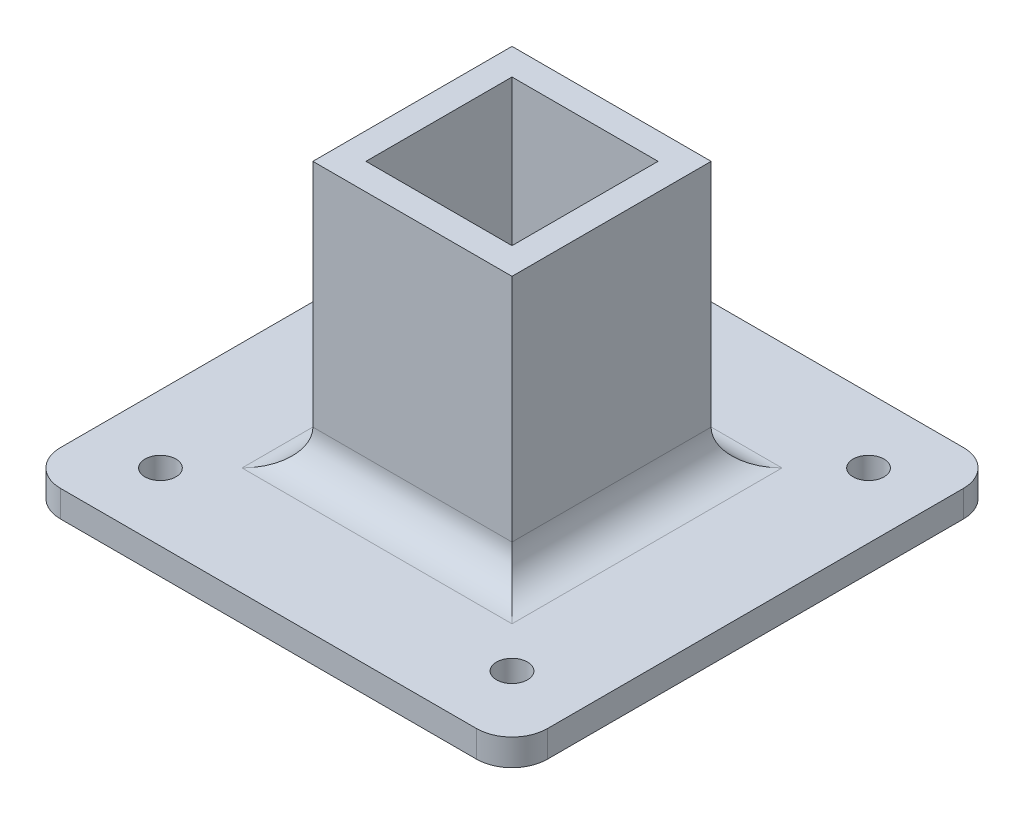
ISO-10303-21;
HEADER;
FILE_DESCRIPTION(('STEP AP214'),'2;1');
FILE_NAME('part.step','',(''),(''),'','','');
FILE_SCHEMA(('AUTOMOTIVE_DESIGN { 1 0 10303 214 1 1 1 1 }'));
ENDSEC;
DATA;
#1=APPLICATION_CONTEXT('core data for automotive mechanical design processes');
#2=APPLICATION_PROTOCOL_DEFINITION('international standard','automotive_design',2000,#1);
#3=PRODUCT_CONTEXT('',#1,'mechanical');
#4=PRODUCT('Part','Part','',(#3));
#5=PRODUCT_RELATED_PRODUCT_CATEGORY('part','',(#4));
#6=PRODUCT_DEFINITION_FORMATION('','',#4);
#7=PRODUCT_DEFINITION_CONTEXT('part definition',#1,'design');
#8=PRODUCT_DEFINITION('design','',#6,#7);
#9=PRODUCT_DEFINITION_SHAPE('','',#8);
#10=(LENGTH_UNIT() NAMED_UNIT(*) SI_UNIT(.MILLI.,.METRE.));
#11=(NAMED_UNIT(*) PLANE_ANGLE_UNIT() SI_UNIT($,.RADIAN.));
#12=(NAMED_UNIT(*) SI_UNIT($,.STERADIAN.) SOLID_ANGLE_UNIT());
#13=UNCERTAINTY_MEASURE_WITH_UNIT(LENGTH_MEASURE(1.E-05),#10,'distance_accuracy_value','');
#14=(GEOMETRIC_REPRESENTATION_CONTEXT(3) GLOBAL_UNCERTAINTY_ASSIGNED_CONTEXT((#13)) GLOBAL_UNIT_ASSIGNED_CONTEXT((#10,
#11,#12)) REPRESENTATION_CONTEXT('',''));
#15=CARTESIAN_POINT('',(0.,0.,0.));
#16=DIRECTION('',(0.,0.,1.));
#17=DIRECTION('',(1.,0.,0.));
#18=AXIS2_PLACEMENT_3D('',#15,#16,#17);
#19=CARTESIAN_POINT('',(0.,3.,0.));
#20=DIRECTION('',(0.,1.,0.));
#21=DIRECTION('',(0.,0.,1.));
#22=AXIS2_PLACEMENT_3D('',#19,#20,#21);
#23=PLANE('',#22);
#24=DIRECTION('',(0.,0.,1.));
#25=VECTOR('',#24,1.);
#26=CARTESIAN_POINT('',(-15.25,3.,0.));
#27=LINE('',#26,#25);
#28=CARTESIAN_POINT('',(-15.25,3.,15.25));
#29=VERTEX_POINT('',#28);
#30=CARTESIAN_POINT('',(-15.25,3.,-15.25));
#31=VERTEX_POINT('',#30);
#32=EDGE_CURVE('E198',#29,#31,#27,.F.);
#33=ORIENTED_EDGE('',*,*,#32,.T.);
#34=DIRECTION('',(-1.,0.,0.));
#35=VECTOR('',#34,1.);
#36=CARTESIAN_POINT('',(0.,3.,-15.25));
#37=LINE('',#36,#35);
#38=CARTESIAN_POINT('',(15.25,3.,-15.25));
#39=VERTEX_POINT('',#38);
#40=EDGE_CURVE('E200',#31,#39,#37,.F.);
#41=ORIENTED_EDGE('',*,*,#40,.T.);
#42=DIRECTION('',(0.,0.,-1.));
#43=VECTOR('',#42,1.);
#44=CARTESIAN_POINT('',(15.25,3.,0.));
#45=LINE('',#44,#43);
#46=CARTESIAN_POINT('',(15.25,3.,15.25));
#47=VERTEX_POINT('',#46);
#48=EDGE_CURVE('E190',#39,#47,#45,.F.);
#49=ORIENTED_EDGE('',*,*,#48,.T.);
#50=DIRECTION('',(1.,0.,0.));
#51=VECTOR('',#50,1.);
#52=CARTESIAN_POINT('',(0.,3.,15.25));
#53=LINE('',#52,#51);
#54=EDGE_CURVE('E196',#47,#29,#53,.F.);
#55=ORIENTED_EDGE('',*,*,#54,.T.);
#56=EDGE_LOOP('',(#33,#41,#49,#55));
#57=FACE_BOUND('',#56,.T.);
#58=CARTESIAN_POINT('',(19.8596314731369,3.,19.8596314731369));
#59=DIRECTION('',(0.,1.,0.));
#60=DIRECTION('',(0.,0.,-1.));
#61=AXIS2_PLACEMENT_3D('',#58,#59,#60);
#62=CIRCLE('',#61,1.75);
#63=CARTESIAN_POINT('',(19.8596314731369,3.,18.1096314731369));
#64=VERTEX_POINT('',#63);
#65=EDGE_CURVE('E311',#64,#64,#62,.T.);
#66=ORIENTED_EDGE('',*,*,#65,.F.);
#67=EDGE_LOOP('',(#66));
#68=FACE_BOUND('',#67,.T.);
#69=CARTESIAN_POINT('',(-19.8596314731369,3.,19.8596314731369));
#70=DIRECTION('',(0.,1.,0.));
#71=DIRECTION('',(0.,0.,1.));
#72=AXIS2_PLACEMENT_3D('',#69,#70,#71);
#73=CIRCLE('',#72,1.75);
#74=CARTESIAN_POINT('',(-19.8596314731369,3.,21.6096314731369));
#75=VERTEX_POINT('',#74);
#76=EDGE_CURVE('E323',#75,#75,#73,.T.);
#77=ORIENTED_EDGE('',*,*,#76,.F.);
#78=EDGE_LOOP('',(#77));
#79=FACE_BOUND('',#78,.T.);
#80=DIRECTION('',(0.,0.,1.));
#81=VECTOR('',#80,1.);
#82=CARTESIAN_POINT('',(-27.5,3.,-27.5));
#83=LINE('',#82,#81);
#84=CARTESIAN_POINT('',(-27.5,3.,-23.5));
#85=VERTEX_POINT('',#84);
#86=CARTESIAN_POINT('',(-27.5,3.,23.5));
#87=VERTEX_POINT('',#86);
#88=EDGE_CURVE('E335',#85,#87,#83,.T.);
#89=ORIENTED_EDGE('',*,*,#88,.T.);
#90=CARTESIAN_POINT('',(-23.5,3.,23.5));
#91=DIRECTION('',(0.,1.,0.));
#92=DIRECTION('',(0.,0.,1.));
#93=AXIS2_PLACEMENT_3D('',#90,#91,#92);
#94=CIRCLE('',#93,4.);
#95=CARTESIAN_POINT('',(-23.5,3.,27.5));
#96=VERTEX_POINT('',#95);
#97=EDGE_CURVE('E243',#87,#96,#94,.T.);
#98=ORIENTED_EDGE('',*,*,#97,.T.);
#99=DIRECTION('',(1.,0.,0.));
#100=VECTOR('',#99,1.);
#101=CARTESIAN_POINT('',(-27.5,3.,27.5));
#102=LINE('',#101,#100);
#103=CARTESIAN_POINT('',(23.5,3.,27.5));
#104=VERTEX_POINT('',#103);
#105=EDGE_CURVE('E181',#96,#104,#102,.T.);
#106=ORIENTED_EDGE('',*,*,#105,.T.);
#107=CARTESIAN_POINT('',(23.5,3.,23.5));
#108=DIRECTION('',(0.,1.,0.));
#109=DIRECTION('',(0.,0.,1.));
#110=AXIS2_PLACEMENT_3D('',#107,#108,#109);
#111=CIRCLE('',#110,4.);
#112=CARTESIAN_POINT('',(27.5,3.,23.5));
#113=VERTEX_POINT('',#112);
#114=EDGE_CURVE('E241',#104,#113,#111,.T.);
#115=ORIENTED_EDGE('',*,*,#114,.T.);
#116=DIRECTION('',(0.,0.,-1.));
#117=VECTOR('',#116,1.);
#118=CARTESIAN_POINT('',(27.5,3.,-27.5));
#119=LINE('',#118,#117);
#120=CARTESIAN_POINT('',(27.5,3.,-23.5));
#121=VERTEX_POINT('',#120);
#122=EDGE_CURVE('E272',#113,#121,#119,.T.);
#123=ORIENTED_EDGE('',*,*,#122,.T.);
#124=CARTESIAN_POINT('',(23.5,3.,-23.5));
#125=DIRECTION('',(0.,1.,0.));
#126=DIRECTION('',(0.,0.,1.));
#127=AXIS2_PLACEMENT_3D('',#124,#125,#126);
#128=CIRCLE('',#127,4.);
#129=CARTESIAN_POINT('',(23.5,3.,-27.5));
#130=VERTEX_POINT('',#129);
#131=EDGE_CURVE('E55',#121,#130,#128,.T.);
#132=ORIENTED_EDGE('',*,*,#131,.T.);
#133=DIRECTION('',(-1.,0.,0.));
#134=VECTOR('',#133,1.);
#135=CARTESIAN_POINT('',(-27.5,3.,-27.5));
#136=LINE('',#135,#134);
#137=CARTESIAN_POINT('',(-23.5,3.,-27.5));
#138=VERTEX_POINT('',#137);
#139=EDGE_CURVE('E254',#130,#138,#136,.T.);
#140=ORIENTED_EDGE('',*,*,#139,.T.);
#141=CARTESIAN_POINT('',(-23.5,3.,-23.5));
#142=DIRECTION('',(0.,1.,0.));
#143=DIRECTION('',(0.,0.,1.));
#144=AXIS2_PLACEMENT_3D('',#141,#142,#143);
#145=CIRCLE('',#144,4.);
#146=EDGE_CURVE('E239',#138,#85,#145,.T.);
#147=ORIENTED_EDGE('',*,*,#146,.T.);
#148=EDGE_LOOP('',(#89,#98,#106,#115,#123,#132,#140,#147));
#149=FACE_BOUND('',#148,.T.);
#150=CARTESIAN_POINT('',(20.1403685268631,3.,-20.1403685268631));
#151=DIRECTION('',(0.,1.,0.));
#152=DIRECTION('',(0.,0.,1.));
#153=AXIS2_PLACEMENT_3D('',#150,#151,#152);
#154=CIRCLE('',#153,1.75);
#155=CARTESIAN_POINT('',(20.1403685268631,3.,-18.3903685268631));
#156=VERTEX_POINT('',#155);
#157=EDGE_CURVE('E267',#156,#156,#154,.T.);
#158=ORIENTED_EDGE('',*,*,#157,.F.);
#159=EDGE_LOOP('',(#158));
#160=FACE_BOUND('',#159,.T.);
#161=CARTESIAN_POINT('',(-20.1403685268631,3.,-20.1403685268631));
#162=DIRECTION('',(0.,1.,0.));
#163=DIRECTION('',(0.,0.,-1.));
#164=AXIS2_PLACEMENT_3D('',#161,#162,#163);
#165=CIRCLE('',#164,1.75);
#166=CARTESIAN_POINT('',(-20.1403685268631,3.,-21.8903685268631));
#167=VERTEX_POINT('',#166);
#168=EDGE_CURVE('E317',#167,#167,#165,.T.);
#169=ORIENTED_EDGE('',*,*,#168,.F.);
#170=EDGE_LOOP('',(#169));
#171=FACE_BOUND('',#170,.T.);
#172=ADVANCED_FACE('F35',(#57,#68,#79,#149,#160,#171),#23,.T.);
#173=CARTESIAN_POINT('',(0.,0.,0.));
#174=DIRECTION('',(0.,1.,0.));
#175=DIRECTION('',(0.,0.,1.));
#176=AXIS2_PLACEMENT_3D('',#173,#174,#175);
#177=PLANE('',#176);
#178=DIRECTION('',(0.,0.,1.));
#179=VECTOR('',#178,1.);
#180=CARTESIAN_POINT('',(-8.25,0.,0.));
#181=LINE('',#180,#179);
#182=CARTESIAN_POINT('',(-8.25,0.,-8.24999999999999));
#183=VERTEX_POINT('',#182);
#184=CARTESIAN_POINT('',(-8.25,0.,8.25));
#185=VERTEX_POINT('',#184);
#186=EDGE_CURVE('E186',#183,#185,#181,.T.);
#187=ORIENTED_EDGE('',*,*,#186,.T.);
#188=DIRECTION('',(1.,0.,0.));
#189=VECTOR('',#188,1.);
#190=CARTESIAN_POINT('',(0.,0.,8.25));
#191=LINE('',#190,#189);
#192=CARTESIAN_POINT('',(8.25,0.,8.25));
#193=VERTEX_POINT('',#192);
#194=EDGE_CURVE('E164',#185,#193,#191,.T.);
#195=ORIENTED_EDGE('',*,*,#194,.T.);
#196=DIRECTION('',(0.,0.,-1.));
#197=VECTOR('',#196,1.);
#198=CARTESIAN_POINT('',(8.25,0.,0.));
#199=LINE('',#198,#197);
#200=CARTESIAN_POINT('',(8.25,0.,-8.25));
#201=VERTEX_POINT('',#200);
#202=EDGE_CURVE('E173',#193,#201,#199,.T.);
#203=ORIENTED_EDGE('',*,*,#202,.T.);
#204=DIRECTION('',(-1.,0.,0.));
#205=VECTOR('',#204,1.);
#206=CARTESIAN_POINT('',(0.,0.,-8.24999999999999));
#207=LINE('',#206,#205);
#208=EDGE_CURVE('E180',#201,#183,#207,.T.);
#209=ORIENTED_EDGE('',*,*,#208,.T.);
#210=EDGE_LOOP('',(#187,#195,#203,#209));
#211=FACE_BOUND('',#210,.T.);
#212=DIRECTION('',(1.,0.,0.));
#213=VECTOR('',#212,1.);
#214=CARTESIAN_POINT('',(-27.5,0.,27.5));
#215=LINE('',#214,#213);
#216=CARTESIAN_POINT('',(-23.5,0.,27.5));
#217=VERTEX_POINT('',#216);
#218=CARTESIAN_POINT('',(23.5,0.,27.5));
#219=VERTEX_POINT('',#218);
#220=EDGE_CURVE('E265',#217,#219,#215,.T.);
#221=ORIENTED_EDGE('',*,*,#220,.F.);
#222=CARTESIAN_POINT('',(-23.5,0.,23.5));
#223=DIRECTION('',(0.,1.,0.));
#224=DIRECTION('',(0.,0.,1.));
#225=AXIS2_PLACEMENT_3D('',#222,#223,#224);
#226=CIRCLE('',#225,4.);
#227=CARTESIAN_POINT('',(-27.5,0.,23.5));
#228=VERTEX_POINT('',#227);
#229=EDGE_CURVE('E231',#217,#228,#226,.F.);
#230=ORIENTED_EDGE('',*,*,#229,.T.);
#231=DIRECTION('',(0.,0.,1.));
#232=VECTOR('',#231,1.);
#233=CARTESIAN_POINT('',(-27.5,0.,-27.5));
#234=LINE('',#233,#232);
#235=CARTESIAN_POINT('',(-27.5,0.,-23.5));
#236=VERTEX_POINT('',#235);
#237=EDGE_CURVE('E261',#236,#228,#234,.T.);
#238=ORIENTED_EDGE('',*,*,#237,.F.);
#239=CARTESIAN_POINT('',(-23.5,0.,-23.5));
#240=DIRECTION('',(0.,1.,0.));
#241=DIRECTION('',(0.,0.,1.));
#242=AXIS2_PLACEMENT_3D('',#239,#240,#241);
#243=CIRCLE('',#242,4.);
#244=CARTESIAN_POINT('',(-23.5,0.,-27.5));
#245=VERTEX_POINT('',#244);
#246=EDGE_CURVE('E227',#236,#245,#243,.F.);
#247=ORIENTED_EDGE('',*,*,#246,.T.);
#248=DIRECTION('',(-1.,0.,0.));
#249=VECTOR('',#248,1.);
#250=CARTESIAN_POINT('',(-27.5,0.,-27.5));
#251=LINE('',#250,#249);
#252=CARTESIAN_POINT('',(23.5,0.,-27.5));
#253=VERTEX_POINT('',#252);
#254=EDGE_CURVE('E253',#253,#245,#251,.T.);
#255=ORIENTED_EDGE('',*,*,#254,.F.);
#256=CARTESIAN_POINT('',(23.5,0.,-23.5));
#257=DIRECTION('',(0.,1.,0.));
#258=DIRECTION('',(0.,0.,1.));
#259=AXIS2_PLACEMENT_3D('',#256,#257,#258);
#260=CIRCLE('',#259,4.);
#261=CARTESIAN_POINT('',(27.5,0.,-23.5));
#262=VERTEX_POINT('',#261);
#263=EDGE_CURVE('E225',#253,#262,#260,.F.);
#264=ORIENTED_EDGE('',*,*,#263,.T.);
#265=DIRECTION('',(0.,0.,-1.));
#266=VECTOR('',#265,1.);
#267=CARTESIAN_POINT('',(27.5,0.,-27.5));
#268=LINE('',#267,#266);
#269=CARTESIAN_POINT('',(27.5,0.,23.5));
#270=VERTEX_POINT('',#269);
#271=EDGE_CURVE('E262',#270,#262,#268,.T.);
#272=ORIENTED_EDGE('',*,*,#271,.F.);
#273=CARTESIAN_POINT('',(23.5,0.,23.5));
#274=DIRECTION('',(0.,1.,0.));
#275=DIRECTION('',(0.,0.,1.));
#276=AXIS2_PLACEMENT_3D('',#273,#274,#275);
#277=CIRCLE('',#276,4.);
#278=EDGE_CURVE('E229',#270,#219,#277,.F.);
#279=ORIENTED_EDGE('',*,*,#278,.T.);
#280=EDGE_LOOP('',(#221,#230,#238,#247,#255,#264,#272,#279));
#281=FACE_BOUND('',#280,.T.);
#282=CARTESIAN_POINT('',(20.1403685268631,0.,-20.1403685268631));
#283=DIRECTION('',(0.,1.,0.));
#284=DIRECTION('',(0.,0.,1.));
#285=AXIS2_PLACEMENT_3D('',#282,#283,#284);
#286=CIRCLE('',#285,1.75);
#287=CARTESIAN_POINT('',(20.1403685268631,0.,-18.3903685268631));
#288=VERTEX_POINT('',#287);
#289=EDGE_CURVE('E326',#288,#288,#286,.T.);
#290=ORIENTED_EDGE('',*,*,#289,.T.);
#291=EDGE_LOOP('',(#290));
#292=FACE_BOUND('',#291,.T.);
#293=CARTESIAN_POINT('',(-19.8596314731369,0.,19.8596314731369));
#294=DIRECTION('',(0.,1.,0.));
#295=DIRECTION('',(0.,0.,1.));
#296=AXIS2_PLACEMENT_3D('',#293,#294,#295);
#297=CIRCLE('',#296,1.75);
#298=CARTESIAN_POINT('',(-19.8596314731369,0.,21.6096314731369));
#299=VERTEX_POINT('',#298);
#300=EDGE_CURVE('E320',#299,#299,#297,.T.);
#301=ORIENTED_EDGE('',*,*,#300,.T.);
#302=EDGE_LOOP('',(#301));
#303=FACE_BOUND('',#302,.T.);
#304=CARTESIAN_POINT('',(-20.1403685268631,0.,-20.1403685268631));
#305=DIRECTION('',(0.,1.,0.));
#306=DIRECTION('',(0.,0.,-1.));
#307=AXIS2_PLACEMENT_3D('',#304,#305,#306);
#308=CIRCLE('',#307,1.75);
#309=CARTESIAN_POINT('',(-20.1403685268631,0.,-21.8903685268631));
#310=VERTEX_POINT('',#309);
#311=EDGE_CURVE('E314',#310,#310,#308,.T.);
#312=ORIENTED_EDGE('',*,*,#311,.T.);
#313=EDGE_LOOP('',(#312));
#314=FACE_BOUND('',#313,.T.);
#315=CARTESIAN_POINT('',(19.8596314731369,0.,19.8596314731369));
#316=DIRECTION('',(0.,1.,0.));
#317=DIRECTION('',(0.,0.,-1.));
#318=AXIS2_PLACEMENT_3D('',#315,#316,#317);
#319=CIRCLE('',#318,1.75);
#320=CARTESIAN_POINT('',(19.8596314731369,0.,18.1096314731369));
#321=VERTEX_POINT('',#320);
#322=EDGE_CURVE('E310',#321,#321,#319,.T.);
#323=ORIENTED_EDGE('',*,*,#322,.T.);
#324=EDGE_LOOP('',(#323));
#325=FACE_BOUND('',#324,.T.);
#326=ADVANCED_FACE('F183',(#211,#281,#292,#303,#314,#325),#177,.F.);
#327=CARTESIAN_POINT('',(27.5,3.,-27.5));
#328=DIRECTION('',(-1.,0.,0.));
#329=DIRECTION('',(0.,0.,1.));
#330=AXIS2_PLACEMENT_3D('',#327,#328,#329);
#331=PLANE('',#330);
#332=ORIENTED_EDGE('',*,*,#122,.F.);
#333=DIRECTION('',(0.,-1.,0.));
#334=VECTOR('',#333,1.);
#335=CARTESIAN_POINT('',(27.5,3.,23.5));
#336=LINE('',#335,#334);
#337=EDGE_CURVE('E247',#113,#270,#336,.T.);
#338=ORIENTED_EDGE('',*,*,#337,.T.);
#339=ORIENTED_EDGE('',*,*,#271,.T.);
#340=DIRECTION('',(0.,-1.,0.));
#341=VECTOR('',#340,1.);
#342=CARTESIAN_POINT('',(27.5,3.,-23.5));
#343=LINE('',#342,#341);
#344=EDGE_CURVE('E245',#262,#121,#343,.F.);
#345=ORIENTED_EDGE('',*,*,#344,.T.);
#346=EDGE_LOOP('',(#332,#338,#339,#345));
#347=FACE_BOUND('',#346,.T.);
#348=ADVANCED_FACE('F350',(#347),#331,.F.);
#349=CARTESIAN_POINT('',(-27.5,3.,-27.5));
#350=DIRECTION('',(0.,0.,1.));
#351=DIRECTION('',(1.,0.,0.));
#352=AXIS2_PLACEMENT_3D('',#349,#350,#351);
#353=PLANE('',#352);
#354=ORIENTED_EDGE('',*,*,#254,.T.);
#355=DIRECTION('',(0.,-1.,0.));
#356=VECTOR('',#355,1.);
#357=CARTESIAN_POINT('',(-23.5,3.,-27.5));
#358=LINE('',#357,#356);
#359=EDGE_CURVE('E11',#245,#138,#358,.F.);
#360=ORIENTED_EDGE('',*,*,#359,.T.);
#361=ORIENTED_EDGE('',*,*,#139,.F.);
#362=DIRECTION('',(0.,-1.,0.));
#363=VECTOR('',#362,1.);
#364=CARTESIAN_POINT('',(23.5,3.,-27.5));
#365=LINE('',#364,#363);
#366=EDGE_CURVE('E43',#130,#253,#365,.T.);
#367=ORIENTED_EDGE('',*,*,#366,.T.);
#368=EDGE_LOOP('',(#354,#360,#361,#367));
#369=FACE_BOUND('',#368,.T.);
#370=ADVANCED_FACE('F252',(#369),#353,.F.);
#371=CARTESIAN_POINT('',(-27.5,3.,-27.5));
#372=DIRECTION('',(1.,0.,0.));
#373=DIRECTION('',(0.,0.,-1.));
#374=AXIS2_PLACEMENT_3D('',#371,#372,#373);
#375=PLANE('',#374);
#376=ORIENTED_EDGE('',*,*,#237,.T.);
#377=DIRECTION('',(0.,-1.,0.));
#378=VECTOR('',#377,1.);
#379=CARTESIAN_POINT('',(-27.5,3.,23.5));
#380=LINE('',#379,#378);
#381=EDGE_CURVE('E236',#228,#87,#380,.F.);
#382=ORIENTED_EDGE('',*,*,#381,.T.);
#383=ORIENTED_EDGE('',*,*,#88,.F.);
#384=DIRECTION('',(0.,-1.,0.));
#385=VECTOR('',#384,1.);
#386=CARTESIAN_POINT('',(-27.5,3.,-23.5));
#387=LINE('',#386,#385);
#388=EDGE_CURVE('E233',#85,#236,#387,.T.);
#389=ORIENTED_EDGE('',*,*,#388,.T.);
#390=EDGE_LOOP('',(#376,#382,#383,#389));
#391=FACE_BOUND('',#390,.T.);
#392=ADVANCED_FACE('F357',(#391),#375,.F.);
#393=CARTESIAN_POINT('',(-27.5,3.,27.5));
#394=DIRECTION('',(0.,0.,-1.));
#395=DIRECTION('',(-1.,0.,0.));
#396=AXIS2_PLACEMENT_3D('',#393,#394,#395);
#397=PLANE('',#396);
#398=ORIENTED_EDGE('',*,*,#105,.F.);
#399=DIRECTION('',(0.,-1.,0.));
#400=VECTOR('',#399,1.);
#401=CARTESIAN_POINT('',(-23.5,3.,27.5));
#402=LINE('',#401,#400);
#403=EDGE_CURVE('E222',#96,#217,#402,.T.);
#404=ORIENTED_EDGE('',*,*,#403,.T.);
#405=ORIENTED_EDGE('',*,*,#220,.T.);
#406=DIRECTION('',(0.,-1.,0.));
#407=VECTOR('',#406,1.);
#408=CARTESIAN_POINT('',(23.5,3.,27.5));
#409=LINE('',#408,#407);
#410=EDGE_CURVE('E209',#219,#104,#409,.F.);
#411=ORIENTED_EDGE('',*,*,#410,.T.);
#412=EDGE_LOOP('',(#398,#404,#405,#411));
#413=FACE_BOUND('',#412,.T.);
#414=ADVANCED_FACE('F352',(#413),#397,.F.);
#415=CARTESIAN_POINT('',(20.1403685268631,3.,-20.1403685268631));
#416=DIRECTION('',(0.,-1.,0.));
#417=DIRECTION('',(0.,0.,-1.));
#418=AXIS2_PLACEMENT_3D('',#415,#416,#417);
#419=CYLINDRICAL_SURFACE('',#418,1.75);
#420=ORIENTED_EDGE('',*,*,#157,.T.);
#421=EDGE_LOOP('',(#420));
#422=FACE_BOUND('',#421,.T.);
#423=ORIENTED_EDGE('',*,*,#289,.F.);
#424=EDGE_LOOP('',(#423));
#425=FACE_BOUND('',#424,.T.);
#426=ADVANCED_FACE('F379',(#422,#425),#419,.F.);
#427=CARTESIAN_POINT('',(-19.8596314731369,3.,19.8596314731369));
#428=DIRECTION('',(0.,-1.,0.));
#429=DIRECTION('',(0.,0.,-1.));
#430=AXIS2_PLACEMENT_3D('',#427,#428,#429);
#431=CYLINDRICAL_SURFACE('',#430,1.75);
#432=ORIENTED_EDGE('',*,*,#76,.T.);
#433=EDGE_LOOP('',(#432));
#434=FACE_BOUND('',#433,.T.);
#435=ORIENTED_EDGE('',*,*,#300,.F.);
#436=EDGE_LOOP('',(#435));
#437=FACE_BOUND('',#436,.T.);
#438=ADVANCED_FACE('F525',(#434,#437),#431,.F.);
#439=CARTESIAN_POINT('',(-20.1403685268631,3.,-20.1403685268631));
#440=DIRECTION('',(0.,-1.,0.));
#441=DIRECTION('',(0.,0.,-1.));
#442=AXIS2_PLACEMENT_3D('',#439,#440,#441);
#443=CYLINDRICAL_SURFACE('',#442,1.75);
#444=ORIENTED_EDGE('',*,*,#168,.T.);
#445=EDGE_LOOP('',(#444));
#446=FACE_BOUND('',#445,.T.);
#447=ORIENTED_EDGE('',*,*,#311,.F.);
#448=EDGE_LOOP('',(#447));
#449=FACE_BOUND('',#448,.T.);
#450=ADVANCED_FACE('F515',(#446,#449),#443,.F.);
#451=CARTESIAN_POINT('',(19.8596314731369,3.,19.8596314731369));
#452=DIRECTION('',(0.,-1.,0.));
#453=DIRECTION('',(0.,0.,-1.));
#454=AXIS2_PLACEMENT_3D('',#451,#452,#453);
#455=CYLINDRICAL_SURFACE('',#454,1.75);
#456=ORIENTED_EDGE('',*,*,#65,.T.);
#457=EDGE_LOOP('',(#456));
#458=FACE_BOUND('',#457,.T.);
#459=ORIENTED_EDGE('',*,*,#322,.F.);
#460=EDGE_LOOP('',(#459));
#461=FACE_BOUND('',#460,.T.);
#462=ADVANCED_FACE('F502',(#458,#461),#455,.F.);
#463=CARTESIAN_POINT('',(0.,33.,0.));
#464=DIRECTION('',(0.,1.,0.));
#465=DIRECTION('',(0.,0.,1.));
#466=AXIS2_PLACEMENT_3D('',#463,#464,#465);
#467=PLANE('',#466);
#468=DIRECTION('',(0.,0.,1.));
#469=VECTOR('',#468,1.);
#470=CARTESIAN_POINT('',(-11.25,33.,11.25));
#471=LINE('',#470,#469);
#472=CARTESIAN_POINT('',(-11.25,33.,-11.25));
#473=VERTEX_POINT('',#472);
#474=CARTESIAN_POINT('',(-11.25,33.,11.25));
#475=VERTEX_POINT('',#474);
#476=EDGE_CURVE('E289',#473,#475,#471,.T.);
#477=ORIENTED_EDGE('',*,*,#476,.T.);
#478=DIRECTION('',(1.,0.,0.));
#479=VECTOR('',#478,1.);
#480=CARTESIAN_POINT('',(11.25,33.,11.25));
#481=LINE('',#480,#479);
#482=CARTESIAN_POINT('',(11.25,33.,11.25));
#483=VERTEX_POINT('',#482);
#484=EDGE_CURVE('E292',#475,#483,#481,.T.);
#485=ORIENTED_EDGE('',*,*,#484,.T.);
#486=DIRECTION('',(0.,0.,-1.));
#487=VECTOR('',#486,1.);
#488=CARTESIAN_POINT('',(11.25,33.,11.25));
#489=LINE('',#488,#487);
#490=CARTESIAN_POINT('',(11.25,33.,-11.25));
#491=VERTEX_POINT('',#490);
#492=EDGE_CURVE('E294',#483,#491,#489,.T.);
#493=ORIENTED_EDGE('',*,*,#492,.T.);
#494=DIRECTION('',(-1.,0.,0.));
#495=VECTOR('',#494,1.);
#496=CARTESIAN_POINT('',(11.25,33.,-11.25));
#497=LINE('',#496,#495);
#498=EDGE_CURVE('E296',#491,#473,#497,.T.);
#499=ORIENTED_EDGE('',*,*,#498,.T.);
#500=EDGE_LOOP('',(#477,#485,#493,#499));
#501=FACE_BOUND('',#500,.T.);
#502=DIRECTION('',(-1.,0.,0.));
#503=VECTOR('',#502,1.);
#504=CARTESIAN_POINT('',(8.25,33.,-8.25));
#505=LINE('',#504,#503);
#506=CARTESIAN_POINT('',(8.25,33.,-8.25));
#507=VERTEX_POINT('',#506);
#508=CARTESIAN_POINT('',(-8.25,33.,-8.24999999999999));
#509=VERTEX_POINT('',#508);
#510=EDGE_CURVE('E278',#507,#509,#505,.T.);
#511=ORIENTED_EDGE('',*,*,#510,.F.);
#512=DIRECTION('',(0.,0.,-1.));
#513=VECTOR('',#512,1.);
#514=CARTESIAN_POINT('',(8.25,33.,8.25));
#515=LINE('',#514,#513);
#516=CARTESIAN_POINT('',(8.25,33.,8.25));
#517=VERTEX_POINT('',#516);
#518=EDGE_CURVE('E220',#517,#507,#515,.T.);
#519=ORIENTED_EDGE('',*,*,#518,.F.);
#520=DIRECTION('',(1.,0.,0.));
#521=VECTOR('',#520,1.);
#522=CARTESIAN_POINT('',(8.25,33.,8.25));
#523=LINE('',#522,#521);
#524=CARTESIAN_POINT('',(-8.25,33.,8.25));
#525=VERTEX_POINT('',#524);
#526=EDGE_CURVE('E167',#525,#517,#523,.T.);
#527=ORIENTED_EDGE('',*,*,#526,.F.);
#528=DIRECTION('',(0.,0.,1.));
#529=VECTOR('',#528,1.);
#530=CARTESIAN_POINT('',(-8.25,33.,8.25));
#531=LINE('',#530,#529);
#532=EDGE_CURVE('E284',#509,#525,#531,.T.);
#533=ORIENTED_EDGE('',*,*,#532,.F.);
#534=EDGE_LOOP('',(#511,#519,#527,#533));
#535=FACE_BOUND('',#534,.T.);
#536=ADVANCED_FACE('F496',(#501,#535),#467,.T.);
#537=CARTESIAN_POINT('',(-11.25,33.,11.25));
#538=DIRECTION('',(1.,0.,0.));
#539=DIRECTION('',(0.,0.,-1.));
#540=AXIS2_PLACEMENT_3D('',#537,#538,#539);
#541=PLANE('',#540);
#542=DIRECTION('',(0.,-1.,0.));
#543=VECTOR('',#542,1.);
#544=CARTESIAN_POINT('',(-11.25,33.,-11.25));
#545=LINE('',#544,#543);
#546=CARTESIAN_POINT('',(-11.25,7.,-11.25));
#547=VERTEX_POINT('',#546);
#548=EDGE_CURVE('E298',#473,#547,#545,.T.);
#549=ORIENTED_EDGE('',*,*,#548,.T.);
#550=DIRECTION('',(0.,0.,1.));
#551=VECTOR('',#550,1.);
#552=CARTESIAN_POINT('',(-11.25,7.,11.25));
#553=LINE('',#552,#551);
#554=CARTESIAN_POINT('',(-11.25,7.,11.25));
#555=VERTEX_POINT('',#554);
#556=EDGE_CURVE('E203',#547,#555,#553,.T.);
#557=ORIENTED_EDGE('',*,*,#556,.T.);
#558=DIRECTION('',(0.,-1.,0.));
#559=VECTOR('',#558,1.);
#560=CARTESIAN_POINT('',(-11.25,33.,11.25));
#561=LINE('',#560,#559);
#562=EDGE_CURVE('E307',#475,#555,#561,.T.);
#563=ORIENTED_EDGE('',*,*,#562,.F.);
#564=ORIENTED_EDGE('',*,*,#476,.F.);
#565=EDGE_LOOP('',(#549,#557,#563,#564));
#566=FACE_BOUND('',#565,.T.);
#567=ADVANCED_FACE('F501',(#566),#541,.F.);
#568=CARTESIAN_POINT('',(11.25,33.,11.25));
#569=DIRECTION('',(0.,0.,-1.));
#570=DIRECTION('',(-1.,0.,0.));
#571=AXIS2_PLACEMENT_3D('',#568,#569,#570);
#572=PLANE('',#571);
#573=ORIENTED_EDGE('',*,*,#562,.T.);
#574=DIRECTION('',(1.,0.,0.));
#575=VECTOR('',#574,1.);
#576=CARTESIAN_POINT('',(11.25,7.,11.25));
#577=LINE('',#576,#575);
#578=CARTESIAN_POINT('',(11.25,7.,11.25));
#579=VERTEX_POINT('',#578);
#580=EDGE_CURVE('E205',#555,#579,#577,.T.);
#581=ORIENTED_EDGE('',*,*,#580,.T.);
#582=DIRECTION('',(0.,-1.,0.));
#583=VECTOR('',#582,1.);
#584=CARTESIAN_POINT('',(11.25,33.,11.25));
#585=LINE('',#584,#583);
#586=EDGE_CURVE('E304',#483,#579,#585,.T.);
#587=ORIENTED_EDGE('',*,*,#586,.F.);
#588=ORIENTED_EDGE('',*,*,#484,.F.);
#589=EDGE_LOOP('',(#573,#581,#587,#588));
#590=FACE_BOUND('',#589,.T.);
#591=ADVANCED_FACE('F595',(#590),#572,.F.);
#592=CARTESIAN_POINT('',(11.25,33.,11.25));
#593=DIRECTION('',(-1.,0.,0.));
#594=DIRECTION('',(0.,0.,1.));
#595=AXIS2_PLACEMENT_3D('',#592,#593,#594);
#596=PLANE('',#595);
#597=ORIENTED_EDGE('',*,*,#586,.T.);
#598=DIRECTION('',(0.,0.,-1.));
#599=VECTOR('',#598,1.);
#600=CARTESIAN_POINT('',(11.25,7.,11.25));
#601=LINE('',#600,#599);
#602=CARTESIAN_POINT('',(11.25,7.,-11.25));
#603=VERTEX_POINT('',#602);
#604=EDGE_CURVE('E207',#579,#603,#601,.T.);
#605=ORIENTED_EDGE('',*,*,#604,.T.);
#606=DIRECTION('',(0.,-1.,0.));
#607=VECTOR('',#606,1.);
#608=CARTESIAN_POINT('',(11.25,33.,-11.25));
#609=LINE('',#608,#607);
#610=EDGE_CURVE('E301',#491,#603,#609,.T.);
#611=ORIENTED_EDGE('',*,*,#610,.F.);
#612=ORIENTED_EDGE('',*,*,#492,.F.);
#613=EDGE_LOOP('',(#597,#605,#611,#612));
#614=FACE_BOUND('',#613,.T.);
#615=ADVANCED_FACE('F599',(#614),#596,.F.);
#616=CARTESIAN_POINT('',(11.25,33.,-11.25));
#617=DIRECTION('',(0.,0.,1.));
#618=DIRECTION('',(1.,0.,0.));
#619=AXIS2_PLACEMENT_3D('',#616,#617,#618);
#620=PLANE('',#619);
#621=ORIENTED_EDGE('',*,*,#610,.T.);
#622=DIRECTION('',(-1.,0.,0.));
#623=VECTOR('',#622,1.);
#624=CARTESIAN_POINT('',(11.25,7.,-11.25));
#625=LINE('',#624,#623);
#626=EDGE_CURVE('E187',#603,#547,#625,.T.);
#627=ORIENTED_EDGE('',*,*,#626,.T.);
#628=ORIENTED_EDGE('',*,*,#548,.F.);
#629=ORIENTED_EDGE('',*,*,#498,.F.);
#630=EDGE_LOOP('',(#621,#627,#628,#629));
#631=FACE_BOUND('',#630,.T.);
#632=ADVANCED_FACE('F487',(#631),#620,.F.);
#633=CARTESIAN_POINT('',(8.25,33.,8.25));
#634=DIRECTION('',(-1.,0.,0.));
#635=DIRECTION('',(0.,0.,1.));
#636=AXIS2_PLACEMENT_3D('',#633,#634,#635);
#637=PLANE('',#636);
#638=DIRECTION('',(0.,-1.,0.));
#639=VECTOR('',#638,1.);
#640=CARTESIAN_POINT('',(8.25,33.,-8.25));
#641=LINE('',#640,#639);
#642=EDGE_CURVE('E176',#507,#201,#641,.T.);
#643=ORIENTED_EDGE('',*,*,#642,.T.);
#644=ORIENTED_EDGE('',*,*,#202,.F.);
#645=DIRECTION('',(0.,-1.,0.));
#646=VECTOR('',#645,1.);
#647=CARTESIAN_POINT('',(8.25,33.,8.25));
#648=LINE('',#647,#646);
#649=EDGE_CURVE('E160',#517,#193,#648,.T.);
#650=ORIENTED_EDGE('',*,*,#649,.F.);
#651=ORIENTED_EDGE('',*,*,#518,.T.);
#652=EDGE_LOOP('',(#643,#644,#650,#651));
#653=FACE_BOUND('',#652,.T.);
#654=ADVANCED_FACE('F174',(#653),#637,.T.);
#655=CARTESIAN_POINT('',(8.25,33.,-8.25));
#656=DIRECTION('',(0.,0.,1.));
#657=DIRECTION('',(1.,0.,0.));
#658=AXIS2_PLACEMENT_3D('',#655,#656,#657);
#659=PLANE('',#658);
#660=DIRECTION('',(0.,-1.,0.));
#661=VECTOR('',#660,1.);
#662=CARTESIAN_POINT('',(-8.25,33.,-8.24999999999999));
#663=LINE('',#662,#661);
#664=EDGE_CURVE('E277',#509,#183,#663,.T.);
#665=ORIENTED_EDGE('',*,*,#664,.T.);
#666=ORIENTED_EDGE('',*,*,#208,.F.);
#667=ORIENTED_EDGE('',*,*,#642,.F.);
#668=ORIENTED_EDGE('',*,*,#510,.T.);
#669=EDGE_LOOP('',(#665,#666,#667,#668));
#670=FACE_BOUND('',#669,.T.);
#671=ADVANCED_FACE('F274',(#670),#659,.T.);
#672=CARTESIAN_POINT('',(-8.25,33.,8.25));
#673=DIRECTION('',(1.,0.,0.));
#674=DIRECTION('',(0.,0.,-1.));
#675=AXIS2_PLACEMENT_3D('',#672,#673,#674);
#676=PLANE('',#675);
#677=DIRECTION('',(0.,-1.,0.));
#678=VECTOR('',#677,1.);
#679=CARTESIAN_POINT('',(-8.25,33.,8.25));
#680=LINE('',#679,#678);
#681=EDGE_CURVE('E170',#525,#185,#680,.T.);
#682=ORIENTED_EDGE('',*,*,#681,.T.);
#683=ORIENTED_EDGE('',*,*,#186,.F.);
#684=ORIENTED_EDGE('',*,*,#664,.F.);
#685=ORIENTED_EDGE('',*,*,#532,.T.);
#686=EDGE_LOOP('',(#682,#683,#684,#685));
#687=FACE_BOUND('',#686,.T.);
#688=ADVANCED_FACE('F283',(#687),#676,.T.);
#689=CARTESIAN_POINT('',(8.25,33.,8.25));
#690=DIRECTION('',(0.,0.,-1.));
#691=DIRECTION('',(-1.,0.,0.));
#692=AXIS2_PLACEMENT_3D('',#689,#690,#691);
#693=PLANE('',#692);
#694=ORIENTED_EDGE('',*,*,#649,.T.);
#695=ORIENTED_EDGE('',*,*,#194,.F.);
#696=ORIENTED_EDGE('',*,*,#681,.F.);
#697=ORIENTED_EDGE('',*,*,#526,.T.);
#698=EDGE_LOOP('',(#694,#695,#696,#697));
#699=FACE_BOUND('',#698,.T.);
#700=ADVANCED_FACE('F162',(#699),#693,.T.);
#701=CARTESIAN_POINT('',(11.25,7.,15.25));
#702=DIRECTION('',(1.,0.,0.));
#703=DIRECTION('',(0.,0.,-1.));
#704=AXIS2_PLACEMENT_3D('',#701,#702,#703);
#705=CYLINDRICAL_SURFACE('',#704,4.);
#706=CARTESIAN_POINT('',(-15.25,7.,15.25));
#707=DIRECTION('',(0.707106781186548,0.,0.707106781186547));
#708=DIRECTION('',(0.707106781186547,0.,-0.707106781186548));
#709=AXIS2_PLACEMENT_3D('',#706,#707,#708);
#710=ELLIPSE('',#709,5.65685424949238,4.);
#711=EDGE_CURVE('E214',#29,#555,#710,.T.);
#712=ORIENTED_EDGE('',*,*,#711,.F.);
#713=ORIENTED_EDGE('',*,*,#54,.F.);
#714=CARTESIAN_POINT('',(15.25,7.,15.25));
#715=DIRECTION('',(0.707106781186547,0.,-0.707106781186548));
#716=DIRECTION('',(-0.707106781186548,0.,-0.707106781186547));
#717=AXIS2_PLACEMENT_3D('',#714,#715,#716);
#718=ELLIPSE('',#717,5.65685424949238,4.);
#719=EDGE_CURVE('E217',#579,#47,#718,.F.);
#720=ORIENTED_EDGE('',*,*,#719,.F.);
#721=ORIENTED_EDGE('',*,*,#580,.F.);
#722=EDGE_LOOP('',(#712,#713,#720,#721));
#723=FACE_BOUND('',#722,.T.);
#724=ADVANCED_FACE('F401',(#723),#705,.F.);
#725=CARTESIAN_POINT('',(15.25,7.,11.25));
#726=DIRECTION('',(0.,0.,-1.));
#727=DIRECTION('',(-1.,0.,0.));
#728=AXIS2_PLACEMENT_3D('',#725,#726,#727);
#729=CYLINDRICAL_SURFACE('',#728,4.);
#730=ORIENTED_EDGE('',*,*,#719,.T.);
#731=ORIENTED_EDGE('',*,*,#48,.F.);
#732=CARTESIAN_POINT('',(15.25,7.,-15.25));
#733=DIRECTION('',(-0.707106781186548,0.,-0.707106781186547));
#734=DIRECTION('',(0.707106781186547,0.,-0.707106781186548));
#735=AXIS2_PLACEMENT_3D('',#732,#733,#734);
#736=ELLIPSE('',#735,5.65685424949238,4.);
#737=EDGE_CURVE('E212',#603,#39,#736,.F.);
#738=ORIENTED_EDGE('',*,*,#737,.F.);
#739=ORIENTED_EDGE('',*,*,#604,.F.);
#740=EDGE_LOOP('',(#730,#731,#738,#739));
#741=FACE_BOUND('',#740,.T.);
#742=ADVANCED_FACE('F397',(#741),#729,.F.);
#743=CARTESIAN_POINT('',(-15.25,7.,11.25));
#744=DIRECTION('',(0.,0.,1.));
#745=DIRECTION('',(1.,0.,0.));
#746=AXIS2_PLACEMENT_3D('',#743,#744,#745);
#747=CYLINDRICAL_SURFACE('',#746,4.);
#748=ORIENTED_EDGE('',*,*,#711,.T.);
#749=ORIENTED_EDGE('',*,*,#556,.F.);
#750=CARTESIAN_POINT('',(-15.25,7.,-15.25));
#751=DIRECTION('',(-0.707106781186547,0.,0.707106781186548));
#752=DIRECTION('',(0.707106781186548,0.,0.707106781186547));
#753=AXIS2_PLACEMENT_3D('',#750,#751,#752);
#754=ELLIPSE('',#753,5.65685424949238,4.);
#755=EDGE_CURVE('E210',#31,#547,#754,.T.);
#756=ORIENTED_EDGE('',*,*,#755,.F.);
#757=ORIENTED_EDGE('',*,*,#32,.F.);
#758=EDGE_LOOP('',(#748,#749,#756,#757));
#759=FACE_BOUND('',#758,.T.);
#760=ADVANCED_FACE('F393',(#759),#747,.F.);
#761=CARTESIAN_POINT('',(11.25,7.,-15.25));
#762=DIRECTION('',(-1.,0.,0.));
#763=DIRECTION('',(0.,0.,1.));
#764=AXIS2_PLACEMENT_3D('',#761,#762,#763);
#765=CYLINDRICAL_SURFACE('',#764,4.);
#766=ORIENTED_EDGE('',*,*,#737,.T.);
#767=ORIENTED_EDGE('',*,*,#40,.F.);
#768=ORIENTED_EDGE('',*,*,#755,.T.);
#769=ORIENTED_EDGE('',*,*,#626,.F.);
#770=EDGE_LOOP('',(#766,#767,#768,#769));
#771=FACE_BOUND('',#770,.T.);
#772=ADVANCED_FACE('F390',(#771),#765,.F.);
#773=CARTESIAN_POINT('',(-23.5,3.,23.5));
#774=DIRECTION('',(0.,-1.,0.));
#775=DIRECTION('',(0.,0.,-1.));
#776=AXIS2_PLACEMENT_3D('',#773,#774,#775);
#777=CYLINDRICAL_SURFACE('',#776,4.);
#778=ORIENTED_EDGE('',*,*,#97,.F.);
#779=ORIENTED_EDGE('',*,*,#381,.F.);
#780=ORIENTED_EDGE('',*,*,#229,.F.);
#781=ORIENTED_EDGE('',*,*,#403,.F.);
#782=EDGE_LOOP('',(#778,#779,#780,#781));
#783=FACE_BOUND('',#782,.T.);
#784=ADVANCED_FACE('F354',(#783),#777,.T.);
#785=CARTESIAN_POINT('',(23.5,3.,23.5));
#786=DIRECTION('',(0.,-1.,0.));
#787=DIRECTION('',(0.,0.,-1.));
#788=AXIS2_PLACEMENT_3D('',#785,#786,#787);
#789=CYLINDRICAL_SURFACE('',#788,4.);
#790=ORIENTED_EDGE('',*,*,#114,.F.);
#791=ORIENTED_EDGE('',*,*,#410,.F.);
#792=ORIENTED_EDGE('',*,*,#278,.F.);
#793=ORIENTED_EDGE('',*,*,#337,.F.);
#794=EDGE_LOOP('',(#790,#791,#792,#793));
#795=FACE_BOUND('',#794,.T.);
#796=ADVANCED_FACE('F348',(#795),#789,.T.);
#797=CARTESIAN_POINT('',(-23.5,3.,-23.5));
#798=DIRECTION('',(0.,-1.,0.));
#799=DIRECTION('',(0.,0.,-1.));
#800=AXIS2_PLACEMENT_3D('',#797,#798,#799);
#801=CYLINDRICAL_SURFACE('',#800,4.);
#802=ORIENTED_EDGE('',*,*,#146,.F.);
#803=ORIENTED_EDGE('',*,*,#359,.F.);
#804=ORIENTED_EDGE('',*,*,#246,.F.);
#805=ORIENTED_EDGE('',*,*,#388,.F.);
#806=EDGE_LOOP('',(#802,#803,#804,#805));
#807=FACE_BOUND('',#806,.T.);
#808=ADVANCED_FACE('F362',(#807),#801,.T.);
#809=CARTESIAN_POINT('',(23.5,3.,-23.5));
#810=DIRECTION('',(0.,-1.,0.));
#811=DIRECTION('',(0.,0.,-1.));
#812=AXIS2_PLACEMENT_3D('',#809,#810,#811);
#813=CYLINDRICAL_SURFACE('',#812,4.);
#814=ORIENTED_EDGE('',*,*,#131,.F.);
#815=ORIENTED_EDGE('',*,*,#344,.F.);
#816=ORIENTED_EDGE('',*,*,#263,.F.);
#817=ORIENTED_EDGE('',*,*,#366,.F.);
#818=EDGE_LOOP('',(#814,#815,#816,#817));
#819=FACE_BOUND('',#818,.T.);
#820=ADVANCED_FACE('F37',(#819),#813,.T.);
#821=CLOSED_SHELL('',(#172,#326,#348,#370,#392,#414,#426,#438,#450,#462,#536,#567,#591,#615,
#632,#654,#671,#688,#700,#724,#742,#760,#772,#784,#796,#808,#820));
#822=MANIFOLD_SOLID_BREP('B2',#821);
#823=ADVANCED_BREP_SHAPE_REPRESENTATION('',(#18,#822),#14);
#824=SHAPE_DEFINITION_REPRESENTATION(#9,#823);
ENDSEC;
END-ISO-10303-21;
